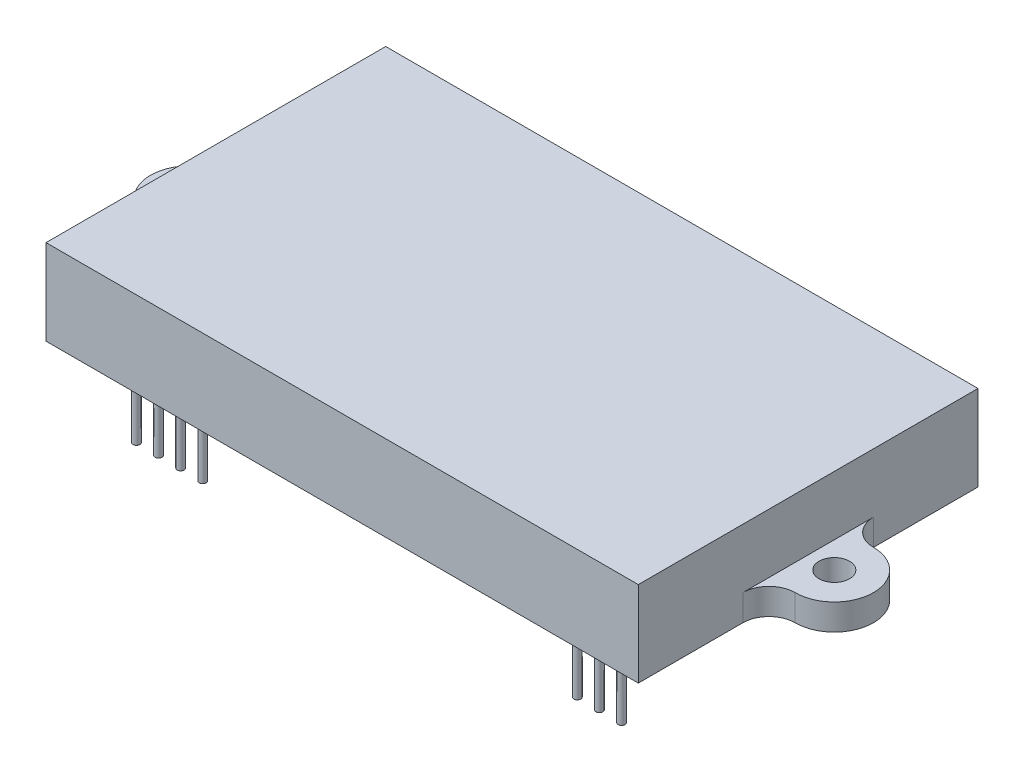
ISO-10303-21;
HEADER;
FILE_DESCRIPTION(('STEP AP214'),'2;1');
FILE_NAME('part.step','',(''),(''),'','','');
FILE_SCHEMA(('AUTOMOTIVE_DESIGN { 1 0 10303 214 1 1 1 1 }'));
ENDSEC;
DATA;
#1=APPLICATION_CONTEXT('core data for automotive mechanical design processes');
#2=APPLICATION_PROTOCOL_DEFINITION('international standard','automotive_design',2000,#1);
#3=PRODUCT_CONTEXT('',#1,'mechanical');
#4=PRODUCT('Part','Part','',(#3));
#5=PRODUCT_RELATED_PRODUCT_CATEGORY('part','',(#4));
#6=PRODUCT_DEFINITION_FORMATION('','',#4);
#7=PRODUCT_DEFINITION_CONTEXT('part definition',#1,'design');
#8=PRODUCT_DEFINITION('design','',#6,#7);
#9=PRODUCT_DEFINITION_SHAPE('','',#8);
#10=(LENGTH_UNIT() NAMED_UNIT(*) SI_UNIT(.MILLI.,.METRE.));
#11=(NAMED_UNIT(*) PLANE_ANGLE_UNIT() SI_UNIT($,.RADIAN.));
#12=(NAMED_UNIT(*) SI_UNIT($,.STERADIAN.) SOLID_ANGLE_UNIT());
#13=UNCERTAINTY_MEASURE_WITH_UNIT(LENGTH_MEASURE(1.E-05),#10,'distance_accuracy_value','');
#14=(GEOMETRIC_REPRESENTATION_CONTEXT(3) GLOBAL_UNCERTAINTY_ASSIGNED_CONTEXT((#13)) GLOBAL_UNIT_ASSIGNED_CONTEXT((#10,
#11,#12)) REPRESENTATION_CONTEXT('',''));
#15=CARTESIAN_POINT('',(0.,0.,0.));
#16=DIRECTION('',(0.,0.,1.));
#17=DIRECTION('',(1.,0.,0.));
#18=AXIS2_PLACEMENT_3D('',#15,#16,#17);
#19=CARTESIAN_POINT('',(0.,9.8,0.));
#20=DIRECTION('',(-1.,0.,0.));
#21=DIRECTION('',(0.,0.,1.));
#22=AXIS2_PLACEMENT_3D('',#19,#20,#21);
#23=PLANE('',#22);
#24=DIRECTION('',(0.,-1.,0.));
#25=VECTOR('',#24,1.);
#26=CARTESIAN_POINT('',(0.,3.,-27.));
#27=LINE('',#26,#25);
#28=CARTESIAN_POINT('',(0.,3.,-27.));
#29=VERTEX_POINT('',#28);
#30=CARTESIAN_POINT('',(0.,0.,-27.));
#31=VERTEX_POINT('',#30);
#32=EDGE_CURVE('E195',#29,#31,#27,.T.);
#33=ORIENTED_EDGE('',*,*,#32,.F.);
#34=DIRECTION('',(0.,0.,-1.));
#35=VECTOR('',#34,1.);
#36=CARTESIAN_POINT('',(0.,3.,-27.));
#37=LINE('',#36,#35);
#38=CARTESIAN_POINT('',(0.,3.,-12.));
#39=VERTEX_POINT('',#38);
#40=EDGE_CURVE('E192',#39,#29,#37,.T.);
#41=ORIENTED_EDGE('',*,*,#40,.F.);
#42=DIRECTION('',(0.,-1.,0.));
#43=VECTOR('',#42,1.);
#44=CARTESIAN_POINT('',(0.,3.,-12.));
#45=LINE('',#44,#43);
#46=CARTESIAN_POINT('',(0.,0.,-12.));
#47=VERTEX_POINT('',#46);
#48=EDGE_CURVE('E207',#39,#47,#45,.T.);
#49=ORIENTED_EDGE('',*,*,#48,.T.);
#50=DIRECTION('',(0.,0.,-1.));
#51=VECTOR('',#50,1.);
#52=CARTESIAN_POINT('',(0.,0.,0.));
#53=LINE('',#52,#51);
#54=CARTESIAN_POINT('',(0.,0.,0.));
#55=VERTEX_POINT('',#54);
#56=EDGE_CURVE('E236',#55,#47,#53,.T.);
#57=ORIENTED_EDGE('',*,*,#56,.F.);
#58=DIRECTION('',(0.,-1.,0.));
#59=VECTOR('',#58,1.);
#60=CARTESIAN_POINT('',(0.,9.8,0.));
#61=LINE('',#60,#59);
#62=CARTESIAN_POINT('',(0.,9.8,0.));
#63=VERTEX_POINT('',#62);
#64=EDGE_CURVE('E250',#63,#55,#61,.T.);
#65=ORIENTED_EDGE('',*,*,#64,.F.);
#66=DIRECTION('',(0.,0.,-1.));
#67=VECTOR('',#66,1.);
#68=CARTESIAN_POINT('',(0.,9.8,0.));
#69=LINE('',#68,#67);
#70=CARTESIAN_POINT('',(0.,9.8,-39.));
#71=VERTEX_POINT('',#70);
#72=EDGE_CURVE('E220',#63,#71,#69,.T.);
#73=ORIENTED_EDGE('',*,*,#72,.T.);
#74=DIRECTION('',(0.,-1.,0.));
#75=VECTOR('',#74,1.);
#76=CARTESIAN_POINT('',(0.,9.8,-39.));
#77=LINE('',#76,#75);
#78=CARTESIAN_POINT('',(0.,0.,-39.));
#79=VERTEX_POINT('',#78);
#80=EDGE_CURVE('E235',#71,#79,#77,.T.);
#81=ORIENTED_EDGE('',*,*,#80,.T.);
#82=EDGE_CURVE('E219',#31,#79,#53,.T.);
#83=ORIENTED_EDGE('',*,*,#82,.F.);
#84=EDGE_LOOP('',(#33,#41,#49,#57,#65,#73,#81,#83));
#85=FACE_BOUND('',#84,.T.);
#86=ADVANCED_FACE('F38',(#85),#23,.T.);
#87=CARTESIAN_POINT('',(0.,9.8,0.));
#88=DIRECTION('',(0.,0.,-1.));
#89=DIRECTION('',(-1.,0.,0.));
#90=AXIS2_PLACEMENT_3D('',#87,#88,#89);
#91=PLANE('',#90);
#92=DIRECTION('',(1.,0.,0.));
#93=VECTOR('',#92,1.);
#94=CARTESIAN_POINT('',(0.,0.,0.));
#95=LINE('',#94,#93);
#96=CARTESIAN_POINT('',(68.,0.,0.));
#97=VERTEX_POINT('',#96);
#98=EDGE_CURVE('E225',#55,#97,#95,.T.);
#99=ORIENTED_EDGE('',*,*,#98,.T.);
#100=DIRECTION('',(0.,-1.,0.));
#101=VECTOR('',#100,1.);
#102=CARTESIAN_POINT('',(68.,9.8,0.));
#103=LINE('',#102,#101);
#104=CARTESIAN_POINT('',(68.,9.8,0.));
#105=VERTEX_POINT('',#104);
#106=EDGE_CURVE('E254',#105,#97,#103,.T.);
#107=ORIENTED_EDGE('',*,*,#106,.F.);
#108=DIRECTION('',(1.,0.,0.));
#109=VECTOR('',#108,1.);
#110=CARTESIAN_POINT('',(0.,9.8,0.));
#111=LINE('',#110,#109);
#112=EDGE_CURVE('E232',#63,#105,#111,.T.);
#113=ORIENTED_EDGE('',*,*,#112,.F.);
#114=ORIENTED_EDGE('',*,*,#64,.T.);
#115=EDGE_LOOP('',(#99,#107,#113,#114));
#116=FACE_BOUND('',#115,.T.);
#117=ADVANCED_FACE('F355',(#116),#91,.F.);
#118=CARTESIAN_POINT('',(68.,9.8,0.));
#119=DIRECTION('',(-1.,0.,0.));
#120=DIRECTION('',(0.,0.,1.));
#121=AXIS2_PLACEMENT_3D('',#118,#119,#120);
#122=PLANE('',#121);
#123=DIRECTION('',(0.,0.,1.));
#124=VECTOR('',#123,1.);
#125=CARTESIAN_POINT('',(68.,3.,-12.));
#126=LINE('',#125,#124);
#127=CARTESIAN_POINT('',(68.,3.,-27.));
#128=VERTEX_POINT('',#127);
#129=CARTESIAN_POINT('',(68.,3.,-12.));
#130=VERTEX_POINT('',#129);
#131=EDGE_CURVE('E54',#128,#130,#126,.T.);
#132=ORIENTED_EDGE('',*,*,#131,.F.);
#133=DIRECTION('',(0.,-1.,0.));
#134=VECTOR('',#133,1.);
#135=CARTESIAN_POINT('',(68.,3.,-27.));
#136=LINE('',#135,#134);
#137=CARTESIAN_POINT('',(68.,0.,-27.));
#138=VERTEX_POINT('',#137);
#139=EDGE_CURVE('E170',#128,#138,#136,.T.);
#140=ORIENTED_EDGE('',*,*,#139,.T.);
#141=DIRECTION('',(0.,0.,-1.));
#142=VECTOR('',#141,1.);
#143=CARTESIAN_POINT('',(68.,0.,0.));
#144=LINE('',#143,#142);
#145=CARTESIAN_POINT('',(68.,0.,-39.));
#146=VERTEX_POINT('',#145);
#147=EDGE_CURVE('E244',#138,#146,#144,.T.);
#148=ORIENTED_EDGE('',*,*,#147,.T.);
#149=DIRECTION('',(0.,-1.,0.));
#150=VECTOR('',#149,1.);
#151=CARTESIAN_POINT('',(68.,9.8,-39.));
#152=LINE('',#151,#150);
#153=CARTESIAN_POINT('',(68.,9.8,-39.));
#154=VERTEX_POINT('',#153);
#155=EDGE_CURVE('E258',#154,#146,#152,.T.);
#156=ORIENTED_EDGE('',*,*,#155,.F.);
#157=DIRECTION('',(0.,0.,-1.));
#158=VECTOR('',#157,1.);
#159=CARTESIAN_POINT('',(68.,9.8,0.));
#160=LINE('',#159,#158);
#161=EDGE_CURVE('E229',#105,#154,#160,.T.);
#162=ORIENTED_EDGE('',*,*,#161,.F.);
#163=ORIENTED_EDGE('',*,*,#106,.T.);
#164=CARTESIAN_POINT('',(68.,0.,-12.));
#165=VERTEX_POINT('',#164);
#166=EDGE_CURVE('E245',#97,#165,#144,.T.);
#167=ORIENTED_EDGE('',*,*,#166,.T.);
#168=DIRECTION('',(0.,-1.,0.));
#169=VECTOR('',#168,1.);
#170=CARTESIAN_POINT('',(68.,3.,-12.));
#171=LINE('',#170,#169);
#172=EDGE_CURVE('E59',#130,#165,#171,.T.);
#173=ORIENTED_EDGE('',*,*,#172,.F.);
#174=EDGE_LOOP('',(#132,#140,#148,#156,#162,#163,#167,#173));
#175=FACE_BOUND('',#174,.T.);
#176=ADVANCED_FACE('F361',(#175),#122,.F.);
#177=CARTESIAN_POINT('',(0.,9.8,-39.));
#178=DIRECTION('',(0.,0.,-1.));
#179=DIRECTION('',(-1.,0.,0.));
#180=AXIS2_PLACEMENT_3D('',#177,#178,#179);
#181=PLANE('',#180);
#182=DIRECTION('',(1.,0.,0.));
#183=VECTOR('',#182,1.);
#184=CARTESIAN_POINT('',(0.,0.,-39.));
#185=LINE('',#184,#183);
#186=EDGE_CURVE('E240',#79,#146,#185,.T.);
#187=ORIENTED_EDGE('',*,*,#186,.F.);
#188=ORIENTED_EDGE('',*,*,#80,.F.);
#189=DIRECTION('',(1.,0.,0.));
#190=VECTOR('',#189,1.);
#191=CARTESIAN_POINT('',(0.,9.8,-39.));
#192=LINE('',#191,#190);
#193=EDGE_CURVE('E224',#71,#154,#192,.T.);
#194=ORIENTED_EDGE('',*,*,#193,.T.);
#195=ORIENTED_EDGE('',*,*,#155,.T.);
#196=EDGE_LOOP('',(#187,#188,#194,#195));
#197=FACE_BOUND('',#196,.T.);
#198=ADVANCED_FACE('F367',(#197),#181,.T.);
#199=CARTESIAN_POINT('',(0.,9.8,0.));
#200=DIRECTION('',(0.,-1.,0.));
#201=DIRECTION('',(0.,0.,-1.));
#202=AXIS2_PLACEMENT_3D('',#199,#200,#201);
#203=PLANE('',#202);
#204=ORIENTED_EDGE('',*,*,#72,.F.);
#205=ORIENTED_EDGE('',*,*,#112,.T.);
#206=ORIENTED_EDGE('',*,*,#161,.T.);
#207=ORIENTED_EDGE('',*,*,#193,.F.);
#208=EDGE_LOOP('',(#204,#205,#206,#207));
#209=FACE_BOUND('',#208,.T.);
#210=ADVANCED_FACE('F406',(#209),#203,.F.);
#211=CARTESIAN_POINT('',(0.,0.,0.));
#212=DIRECTION('',(0.,-1.,0.));
#213=DIRECTION('',(0.,0.,-1.));
#214=AXIS2_PLACEMENT_3D('',#211,#212,#213);
#215=PLANE('',#214);
#216=CARTESIAN_POINT('',(62.08,0.,-4.));
#217=DIRECTION('',(0.,-1.,0.));
#218=DIRECTION('',(0.,0.,-1.));
#219=AXIS2_PLACEMENT_3D('',#216,#217,#218);
#220=CIRCLE('',#219,0.399999999999998);
#221=CARTESIAN_POINT('',(62.08,0.,-4.4));
#222=VERTEX_POINT('',#221);
#223=EDGE_CURVE('E288',#222,#222,#220,.T.);
#224=ORIENTED_EDGE('',*,*,#223,.F.);
#225=EDGE_LOOP('',(#224));
#226=FACE_BOUND('',#225,.T.);
#227=CARTESIAN_POINT('',(59.54,0.,-4.));
#228=DIRECTION('',(0.,-1.,0.));
#229=DIRECTION('',(0.,0.,-1.));
#230=AXIS2_PLACEMENT_3D('',#227,#228,#229);
#231=CIRCLE('',#230,0.399999999999998);
#232=CARTESIAN_POINT('',(59.54,0.,-4.4));
#233=VERTEX_POINT('',#232);
#234=EDGE_CURVE('E284',#233,#233,#231,.T.);
#235=ORIENTED_EDGE('',*,*,#234,.F.);
#236=EDGE_LOOP('',(#235));
#237=FACE_BOUND('',#236,.T.);
#238=CARTESIAN_POINT('',(6.38,0.,-3.99999999999995));
#239=DIRECTION('',(0.,-1.,0.));
#240=DIRECTION('',(0.,0.,-1.));
#241=AXIS2_PLACEMENT_3D('',#238,#239,#240);
#242=CIRCLE('',#241,0.4);
#243=CARTESIAN_POINT('',(6.38,0.,-4.39999999999995));
#244=VERTEX_POINT('',#243);
#245=EDGE_CURVE('E280',#244,#244,#242,.T.);
#246=ORIENTED_EDGE('',*,*,#245,.F.);
#247=EDGE_LOOP('',(#246));
#248=FACE_BOUND('',#247,.T.);
#249=CARTESIAN_POINT('',(8.92,0.,-3.99999999999997));
#250=DIRECTION('',(0.,-1.,0.));
#251=DIRECTION('',(0.,0.,-1.));
#252=AXIS2_PLACEMENT_3D('',#249,#250,#251);
#253=CIRCLE('',#252,0.399999999999998);
#254=CARTESIAN_POINT('',(8.92,0.,-4.39999999999996));
#255=VERTEX_POINT('',#254);
#256=EDGE_CURVE('E276',#255,#255,#253,.T.);
#257=ORIENTED_EDGE('',*,*,#256,.F.);
#258=EDGE_LOOP('',(#257));
#259=FACE_BOUND('',#258,.T.);
#260=CARTESIAN_POINT('',(11.46,0.,-3.99999999999998));
#261=DIRECTION('',(0.,-1.,0.));
#262=DIRECTION('',(0.,0.,-1.));
#263=AXIS2_PLACEMENT_3D('',#260,#261,#262);
#264=CIRCLE('',#263,0.4);
#265=CARTESIAN_POINT('',(11.46,0.,-4.39999999999998));
#266=VERTEX_POINT('',#265);
#267=EDGE_CURVE('E272',#266,#266,#264,.T.);
#268=ORIENTED_EDGE('',*,*,#267,.F.);
#269=EDGE_LOOP('',(#268));
#270=FACE_BOUND('',#269,.T.);
#271=CARTESIAN_POINT('',(57.,0.,-4.));
#272=DIRECTION('',(0.,-1.,0.));
#273=DIRECTION('',(0.,0.,-1.));
#274=AXIS2_PLACEMENT_3D('',#271,#272,#273);
#275=CIRCLE('',#274,0.399999999999998);
#276=CARTESIAN_POINT('',(57.,0.,-4.4));
#277=VERTEX_POINT('',#276);
#278=EDGE_CURVE('E268',#277,#277,#275,.T.);
#279=ORIENTED_EDGE('',*,*,#278,.F.);
#280=EDGE_LOOP('',(#279));
#281=FACE_BOUND('',#280,.T.);
#282=CARTESIAN_POINT('',(14.,0.,-4.));
#283=DIRECTION('',(0.,-1.,0.));
#284=DIRECTION('',(0.,0.,-1.));
#285=AXIS2_PLACEMENT_3D('',#282,#283,#284);
#286=CIRCLE('',#285,0.4);
#287=CARTESIAN_POINT('',(14.,0.,-4.4));
#288=VERTEX_POINT('',#287);
#289=EDGE_CURVE('E253',#288,#288,#286,.T.);
#290=ORIENTED_EDGE('',*,*,#289,.F.);
#291=EDGE_LOOP('',(#290));
#292=FACE_BOUND('',#291,.T.);
#293=ORIENTED_EDGE('',*,*,#56,.T.);
#294=CARTESIAN_POINT('',(-3.,0.,-12.));
#295=DIRECTION('',(0.,-1.,0.));
#296=DIRECTION('',(0.,0.,-1.));
#297=AXIS2_PLACEMENT_3D('',#294,#295,#296);
#298=CIRCLE('',#297,3.);
#299=CARTESIAN_POINT('',(-3.,0.,-15.));
#300=VERTEX_POINT('',#299);
#301=EDGE_CURVE('E187',#300,#47,#298,.T.);
#302=ORIENTED_EDGE('',*,*,#301,.F.);
#303=CARTESIAN_POINT('',(-3.,0.,-19.5));
#304=DIRECTION('',(0.,1.,0.));
#305=DIRECTION('',(0.,0.,1.));
#306=AXIS2_PLACEMENT_3D('',#303,#304,#305);
#307=CIRCLE('',#306,4.5);
#308=CARTESIAN_POINT('',(-3.,0.,-24.));
#309=VERTEX_POINT('',#308);
#310=EDGE_CURVE('E199',#309,#300,#307,.T.);
#311=ORIENTED_EDGE('',*,*,#310,.F.);
#312=CARTESIAN_POINT('',(-3.,0.,-27.));
#313=DIRECTION('',(0.,-1.,0.));
#314=DIRECTION('',(0.,0.,1.));
#315=AXIS2_PLACEMENT_3D('',#312,#313,#314);
#316=CIRCLE('',#315,3.);
#317=EDGE_CURVE('E178',#31,#309,#316,.T.);
#318=ORIENTED_EDGE('',*,*,#317,.F.);
#319=ORIENTED_EDGE('',*,*,#82,.T.);
#320=ORIENTED_EDGE('',*,*,#186,.T.);
#321=ORIENTED_EDGE('',*,*,#147,.F.);
#322=CARTESIAN_POINT('',(71.,0.,-27.));
#323=DIRECTION('',(0.,-1.,0.));
#324=DIRECTION('',(0.,0.,-1.));
#325=AXIS2_PLACEMENT_3D('',#322,#323,#324);
#326=CIRCLE('',#325,3.);
#327=CARTESIAN_POINT('',(71.,0.,-24.));
#328=VERTEX_POINT('',#327);
#329=EDGE_CURVE('E157',#328,#138,#326,.T.);
#330=ORIENTED_EDGE('',*,*,#329,.F.);
#331=CARTESIAN_POINT('',(71.,0.,-19.5));
#332=DIRECTION('',(0.,1.,0.));
#333=DIRECTION('',(0.,0.,-1.));
#334=AXIS2_PLACEMENT_3D('',#331,#332,#333);
#335=CIRCLE('',#334,4.5);
#336=CARTESIAN_POINT('',(71.,0.,-15.));
#337=VERTEX_POINT('',#336);
#338=EDGE_CURVE('E164',#337,#328,#335,.T.);
#339=ORIENTED_EDGE('',*,*,#338,.F.);
#340=CARTESIAN_POINT('',(71.,0.,-12.));
#341=DIRECTION('',(0.,-1.,0.));
#342=DIRECTION('',(0.,0.,1.));
#343=AXIS2_PLACEMENT_3D('',#340,#341,#342);
#344=CIRCLE('',#343,3.);
#345=EDGE_CURVE('E140',#165,#337,#344,.T.);
#346=ORIENTED_EDGE('',*,*,#345,.F.);
#347=ORIENTED_EDGE('',*,*,#166,.F.);
#348=ORIENTED_EDGE('',*,*,#98,.F.);
#349=EDGE_LOOP('',(#293,#302,#311,#318,#319,#320,#321,#330,#339,#346,#347,#348));
#350=FACE_BOUND('',#349,.T.);
#351=CARTESIAN_POINT('',(-3.,0.,-19.5));
#352=DIRECTION('',(0.,1.,0.));
#353=DIRECTION('',(0.,0.,1.));
#354=AXIS2_PLACEMENT_3D('',#351,#352,#353);
#355=CIRCLE('',#354,1.75);
#356=CARTESIAN_POINT('',(-3.,0.,-17.75));
#357=VERTEX_POINT('',#356);
#358=EDGE_CURVE('E173',#357,#357,#355,.T.);
#359=ORIENTED_EDGE('',*,*,#358,.T.);
#360=EDGE_LOOP('',(#359));
#361=FACE_BOUND('',#360,.T.);
#362=CARTESIAN_POINT('',(71.,0.,-19.5));
#363=DIRECTION('',(0.,1.,0.));
#364=DIRECTION('',(0.,0.,1.));
#365=AXIS2_PLACEMENT_3D('',#362,#363,#364);
#366=CIRCLE('',#365,1.75);
#367=CARTESIAN_POINT('',(71.,0.,-17.75));
#368=VERTEX_POINT('',#367);
#369=EDGE_CURVE('E423',#368,#368,#366,.T.);
#370=ORIENTED_EDGE('',*,*,#369,.T.);
#371=EDGE_LOOP('',(#370));
#372=FACE_BOUND('',#371,.T.);
#373=ADVANCED_FACE('F402',(#226,#237,#248,#259,#270,#281,#292,#350,#361,#372),#215,.T.);
#374=CARTESIAN_POINT('',(-3.,3.,-27.));
#375=DIRECTION('',(0.,1.,0.));
#376=DIRECTION('',(0.,0.,1.));
#377=AXIS2_PLACEMENT_3D('',#374,#375,#376);
#378=PLANE('',#377);
#379=CARTESIAN_POINT('',(-3.,3.,-27.));
#380=DIRECTION('',(0.,-1.,0.));
#381=DIRECTION('',(0.,0.,1.));
#382=AXIS2_PLACEMENT_3D('',#379,#380,#381);
#383=CIRCLE('',#382,3.);
#384=CARTESIAN_POINT('',(-3.,3.,-24.));
#385=VERTEX_POINT('',#384);
#386=EDGE_CURVE('E182',#29,#385,#383,.T.);
#387=ORIENTED_EDGE('',*,*,#386,.T.);
#388=CARTESIAN_POINT('',(-3.,3.,-19.5));
#389=DIRECTION('',(0.,1.,0.));
#390=DIRECTION('',(0.,0.,1.));
#391=AXIS2_PLACEMENT_3D('',#388,#389,#390);
#392=CIRCLE('',#391,4.5);
#393=CARTESIAN_POINT('',(-3.,3.,-15.));
#394=VERTEX_POINT('',#393);
#395=EDGE_CURVE('E186',#385,#394,#392,.T.);
#396=ORIENTED_EDGE('',*,*,#395,.T.);
#397=CARTESIAN_POINT('',(-3.,3.,-12.));
#398=DIRECTION('',(0.,-1.,0.));
#399=DIRECTION('',(0.,0.,-1.));
#400=AXIS2_PLACEMENT_3D('',#397,#398,#399);
#401=CIRCLE('',#400,3.);
#402=EDGE_CURVE('E190',#394,#39,#401,.T.);
#403=ORIENTED_EDGE('',*,*,#402,.T.);
#404=ORIENTED_EDGE('',*,*,#40,.T.);
#405=EDGE_LOOP('',(#387,#396,#403,#404));
#406=FACE_BOUND('',#405,.T.);
#407=CARTESIAN_POINT('',(-3.,3.,-19.5));
#408=DIRECTION('',(0.,1.,0.));
#409=DIRECTION('',(0.,0.,1.));
#410=AXIS2_PLACEMENT_3D('',#407,#408,#409);
#411=CIRCLE('',#410,1.75);
#412=CARTESIAN_POINT('',(-3.,3.,-17.75));
#413=VERTEX_POINT('',#412);
#414=EDGE_CURVE('E174',#413,#413,#411,.T.);
#415=ORIENTED_EDGE('',*,*,#414,.F.);
#416=EDGE_LOOP('',(#415));
#417=FACE_BOUND('',#416,.T.);
#418=ADVANCED_FACE('F405',(#406,#417),#378,.T.);
#419=CARTESIAN_POINT('',(-3.,3.,-27.));
#420=DIRECTION('',(0.,-1.,0.));
#421=DIRECTION('',(0.,0.,-1.));
#422=AXIS2_PLACEMENT_3D('',#419,#420,#421);
#423=CYLINDRICAL_SURFACE('',#422,3.);
#424=ORIENTED_EDGE('',*,*,#317,.T.);
#425=DIRECTION('',(0.,-1.,0.));
#426=VECTOR('',#425,1.);
#427=CARTESIAN_POINT('',(-3.,3.,-24.));
#428=LINE('',#427,#426);
#429=EDGE_CURVE('E215',#385,#309,#428,.T.);
#430=ORIENTED_EDGE('',*,*,#429,.F.);
#431=ORIENTED_EDGE('',*,*,#386,.F.);
#432=ORIENTED_EDGE('',*,*,#32,.T.);
#433=EDGE_LOOP('',(#424,#430,#431,#432));
#434=FACE_BOUND('',#433,.T.);
#435=ADVANCED_FACE('F467',(#434),#423,.F.);
#436=CARTESIAN_POINT('',(-3.,3.,-19.5));
#437=DIRECTION('',(0.,-1.,0.));
#438=DIRECTION('',(0.,0.,-1.));
#439=AXIS2_PLACEMENT_3D('',#436,#437,#438);
#440=CYLINDRICAL_SURFACE('',#439,4.5);
#441=ORIENTED_EDGE('',*,*,#310,.T.);
#442=DIRECTION('',(0.,-1.,0.));
#443=VECTOR('',#442,1.);
#444=CARTESIAN_POINT('',(-3.,3.,-15.));
#445=LINE('',#444,#443);
#446=EDGE_CURVE('E211',#394,#300,#445,.T.);
#447=ORIENTED_EDGE('',*,*,#446,.F.);
#448=ORIENTED_EDGE('',*,*,#395,.F.);
#449=ORIENTED_EDGE('',*,*,#429,.T.);
#450=EDGE_LOOP('',(#441,#447,#448,#449));
#451=FACE_BOUND('',#450,.T.);
#452=ADVANCED_FACE('F471',(#451),#440,.T.);
#453=CARTESIAN_POINT('',(-3.,3.,-12.));
#454=DIRECTION('',(0.,-1.,0.));
#455=DIRECTION('',(0.,0.,-1.));
#456=AXIS2_PLACEMENT_3D('',#453,#454,#455);
#457=CYLINDRICAL_SURFACE('',#456,3.);
#458=ORIENTED_EDGE('',*,*,#301,.T.);
#459=ORIENTED_EDGE('',*,*,#48,.F.);
#460=ORIENTED_EDGE('',*,*,#402,.F.);
#461=ORIENTED_EDGE('',*,*,#446,.T.);
#462=EDGE_LOOP('',(#458,#459,#460,#461));
#463=FACE_BOUND('',#462,.T.);
#464=ADVANCED_FACE('F463',(#463),#457,.F.);
#465=CARTESIAN_POINT('',(-3.,3.,-19.5));
#466=DIRECTION('',(0.,-1.,0.));
#467=DIRECTION('',(0.,0.,-1.));
#468=AXIS2_PLACEMENT_3D('',#465,#466,#467);
#469=CYLINDRICAL_SURFACE('',#468,1.75);
#470=ORIENTED_EDGE('',*,*,#414,.T.);
#471=EDGE_LOOP('',(#470));
#472=FACE_BOUND('',#471,.T.);
#473=ORIENTED_EDGE('',*,*,#358,.F.);
#474=EDGE_LOOP('',(#473));
#475=FACE_BOUND('',#474,.T.);
#476=ADVANCED_FACE('F457',(#472,#475),#469,.F.);
#477=CARTESIAN_POINT('',(71.,3.,-27.));
#478=DIRECTION('',(0.,-1.,0.));
#479=DIRECTION('',(0.,0.,-1.));
#480=AXIS2_PLACEMENT_3D('',#477,#478,#479);
#481=PLANE('',#480);
#482=CARTESIAN_POINT('',(71.,3.,-27.));
#483=DIRECTION('',(0.,-1.,0.));
#484=DIRECTION('',(0.,0.,-1.));
#485=AXIS2_PLACEMENT_3D('',#482,#483,#484);
#486=CIRCLE('',#485,3.);
#487=CARTESIAN_POINT('',(71.,3.,-24.));
#488=VERTEX_POINT('',#487);
#489=EDGE_CURVE('E166',#488,#128,#486,.T.);
#490=ORIENTED_EDGE('',*,*,#489,.T.);
#491=ORIENTED_EDGE('',*,*,#131,.T.);
#492=CARTESIAN_POINT('',(71.,3.,-12.));
#493=DIRECTION('',(0.,-1.,0.));
#494=DIRECTION('',(0.,0.,1.));
#495=AXIS2_PLACEMENT_3D('',#492,#493,#494);
#496=CIRCLE('',#495,3.);
#497=CARTESIAN_POINT('',(71.,3.,-15.));
#498=VERTEX_POINT('',#497);
#499=EDGE_CURVE('E126',#130,#498,#496,.T.);
#500=ORIENTED_EDGE('',*,*,#499,.T.);
#501=CARTESIAN_POINT('',(71.,3.,-19.5));
#502=DIRECTION('',(0.,1.,0.));
#503=DIRECTION('',(0.,0.,-1.));
#504=AXIS2_PLACEMENT_3D('',#501,#502,#503);
#505=CIRCLE('',#504,4.5);
#506=EDGE_CURVE('E131',#498,#488,#505,.T.);
#507=ORIENTED_EDGE('',*,*,#506,.T.);
#508=EDGE_LOOP('',(#490,#491,#500,#507));
#509=FACE_BOUND('',#508,.T.);
#510=CARTESIAN_POINT('',(71.,3.,-19.5));
#511=DIRECTION('',(0.,1.,0.));
#512=DIRECTION('',(0.,0.,1.));
#513=AXIS2_PLACEMENT_3D('',#510,#511,#512);
#514=CIRCLE('',#513,1.75);
#515=CARTESIAN_POINT('',(71.,3.,-17.75));
#516=VERTEX_POINT('',#515);
#517=EDGE_CURVE('E161',#516,#516,#514,.T.);
#518=ORIENTED_EDGE('',*,*,#517,.F.);
#519=EDGE_LOOP('',(#518));
#520=FACE_BOUND('',#519,.T.);
#521=ADVANCED_FACE('F128',(#509,#520),#481,.F.);
#522=CARTESIAN_POINT('',(71.,3.,-27.));
#523=DIRECTION('',(0.,-1.,0.));
#524=DIRECTION('',(0.,0.,-1.));
#525=AXIS2_PLACEMENT_3D('',#522,#523,#524);
#526=CYLINDRICAL_SURFACE('',#525,3.);
#527=ORIENTED_EDGE('',*,*,#329,.T.);
#528=ORIENTED_EDGE('',*,*,#139,.F.);
#529=ORIENTED_EDGE('',*,*,#489,.F.);
#530=DIRECTION('',(0.,-1.,0.));
#531=VECTOR('',#530,1.);
#532=CARTESIAN_POINT('',(71.,3.,-24.));
#533=LINE('',#532,#531);
#534=EDGE_CURVE('E144',#488,#328,#533,.T.);
#535=ORIENTED_EDGE('',*,*,#534,.T.);
#536=EDGE_LOOP('',(#527,#528,#529,#535));
#537=FACE_BOUND('',#536,.T.);
#538=ADVANCED_FACE('F449',(#537),#526,.F.);
#539=CARTESIAN_POINT('',(71.,3.,-12.));
#540=DIRECTION('',(0.,-1.,0.));
#541=DIRECTION('',(0.,0.,-1.));
#542=AXIS2_PLACEMENT_3D('',#539,#540,#541);
#543=CYLINDRICAL_SURFACE('',#542,3.);
#544=ORIENTED_EDGE('',*,*,#345,.T.);
#545=DIRECTION('',(0.,-1.,0.));
#546=VECTOR('',#545,1.);
#547=CARTESIAN_POINT('',(71.,3.,-15.));
#548=LINE('',#547,#546);
#549=EDGE_CURVE('E137',#498,#337,#548,.T.);
#550=ORIENTED_EDGE('',*,*,#549,.F.);
#551=ORIENTED_EDGE('',*,*,#499,.F.);
#552=ORIENTED_EDGE('',*,*,#172,.T.);
#553=EDGE_LOOP('',(#544,#550,#551,#552));
#554=FACE_BOUND('',#553,.T.);
#555=ADVANCED_FACE('F138',(#554),#543,.F.);
#556=CARTESIAN_POINT('',(71.,3.,-19.5));
#557=DIRECTION('',(0.,-1.,0.));
#558=DIRECTION('',(0.,0.,-1.));
#559=AXIS2_PLACEMENT_3D('',#556,#557,#558);
#560=CYLINDRICAL_SURFACE('',#559,4.5);
#561=ORIENTED_EDGE('',*,*,#338,.T.);
#562=ORIENTED_EDGE('',*,*,#534,.F.);
#563=ORIENTED_EDGE('',*,*,#506,.F.);
#564=ORIENTED_EDGE('',*,*,#549,.T.);
#565=EDGE_LOOP('',(#561,#562,#563,#564));
#566=FACE_BOUND('',#565,.T.);
#567=ADVANCED_FACE('F146',(#566),#560,.T.);
#568=CARTESIAN_POINT('',(71.,3.,-19.5));
#569=DIRECTION('',(0.,-1.,0.));
#570=DIRECTION('',(0.,0.,-1.));
#571=AXIS2_PLACEMENT_3D('',#568,#569,#570);
#572=CYLINDRICAL_SURFACE('',#571,1.75);
#573=ORIENTED_EDGE('',*,*,#517,.T.);
#574=EDGE_LOOP('',(#573));
#575=FACE_BOUND('',#574,.T.);
#576=ORIENTED_EDGE('',*,*,#369,.F.);
#577=EDGE_LOOP('',(#576));
#578=FACE_BOUND('',#577,.T.);
#579=ADVANCED_FACE('F526',(#575,#578),#572,.F.);
#580=CARTESIAN_POINT('',(14.,-8.9,-4.));
#581=DIRECTION('',(0.,1.,0.));
#582=DIRECTION('',(0.,0.,1.));
#583=AXIS2_PLACEMENT_3D('',#580,#581,#582);
#584=CYLINDRICAL_SURFACE('',#583,0.4);
#585=CARTESIAN_POINT('',(14.,-8.88,-4.));
#586=DIRECTION('',(0.,1.,0.));
#587=DIRECTION('',(0.,0.,1.));
#588=AXIS2_PLACEMENT_3D('',#585,#586,#587);
#589=CIRCLE('',#588,0.4);
#590=CARTESIAN_POINT('',(14.,-8.88,-3.6));
#591=VERTEX_POINT('',#590);
#592=EDGE_CURVE('E47',#591,#591,#589,.T.);
#593=ORIENTED_EDGE('',*,*,#592,.T.);
#594=EDGE_LOOP('',(#593));
#595=FACE_BOUND('',#594,.T.);
#596=ORIENTED_EDGE('',*,*,#289,.T.);
#597=EDGE_LOOP('',(#596));
#598=FACE_BOUND('',#597,.T.);
#599=ADVANCED_FACE('F342',(#595,#598),#584,.T.);
#600=CARTESIAN_POINT('',(14.,-8.9,-4.));
#601=DIRECTION('',(0.,1.,0.));
#602=DIRECTION('',(0.,0.,1.));
#603=AXIS2_PLACEMENT_3D('',#600,#601,#602);
#604=PLANE('',#603);
#605=CARTESIAN_POINT('',(14.,-8.9,-4.));
#606=DIRECTION('',(0.,1.,0.));
#607=DIRECTION('',(0.,0.,1.));
#608=AXIS2_PLACEMENT_3D('',#605,#606,#607);
#609=CIRCLE('',#608,0.38);
#610=CARTESIAN_POINT('',(14.,-8.9,-3.62));
#611=VERTEX_POINT('',#610);
#612=EDGE_CURVE('E11',#611,#611,#609,.F.);
#613=ORIENTED_EDGE('',*,*,#612,.T.);
#614=EDGE_LOOP('',(#613));
#615=FACE_BOUND('',#614,.T.);
#616=ADVANCED_FACE('F541',(#615),#604,.F.);
#617=CARTESIAN_POINT('',(57.,-8.9,-4.));
#618=DIRECTION('',(0.,1.,0.));
#619=DIRECTION('',(0.,0.,1.));
#620=AXIS2_PLACEMENT_3D('',#617,#618,#619);
#621=CYLINDRICAL_SURFACE('',#620,0.399999999999998);
#622=CARTESIAN_POINT('',(57.,-8.88,-4.));
#623=DIRECTION('',(0.,1.,0.));
#624=DIRECTION('',(0.,0.,1.));
#625=AXIS2_PLACEMENT_3D('',#622,#623,#624);
#626=CIRCLE('',#625,0.399999999999998);
#627=CARTESIAN_POINT('',(57.,-8.88,-3.6));
#628=VERTEX_POINT('',#627);
#629=EDGE_CURVE('E308',#628,#628,#626,.T.);
#630=ORIENTED_EDGE('',*,*,#629,.T.);
#631=EDGE_LOOP('',(#630));
#632=FACE_BOUND('',#631,.T.);
#633=ORIENTED_EDGE('',*,*,#278,.T.);
#634=EDGE_LOOP('',(#633));
#635=FACE_BOUND('',#634,.T.);
#636=ADVANCED_FACE('F549',(#632,#635),#621,.T.);
#637=CARTESIAN_POINT('',(57.,-8.9,-4.));
#638=DIRECTION('',(0.,1.,0.));
#639=DIRECTION('',(0.,0.,1.));
#640=AXIS2_PLACEMENT_3D('',#637,#638,#639);
#641=PLANE('',#640);
#642=CARTESIAN_POINT('',(57.,-8.9,-4.));
#643=DIRECTION('',(0.,1.,0.));
#644=DIRECTION('',(0.,0.,1.));
#645=AXIS2_PLACEMENT_3D('',#642,#643,#644);
#646=CIRCLE('',#645,0.379999999999998);
#647=CARTESIAN_POINT('',(57.,-8.9,-3.62));
#648=VERTEX_POINT('',#647);
#649=EDGE_CURVE('E312',#648,#648,#646,.F.);
#650=ORIENTED_EDGE('',*,*,#649,.T.);
#651=EDGE_LOOP('',(#650));
#652=FACE_BOUND('',#651,.T.);
#653=ADVANCED_FACE('F558',(#652),#641,.F.);
#654=CARTESIAN_POINT('',(11.46,-8.9,-3.99999999999998));
#655=DIRECTION('',(0.,1.,0.));
#656=DIRECTION('',(0.,0.,1.));
#657=AXIS2_PLACEMENT_3D('',#654,#655,#656);
#658=CYLINDRICAL_SURFACE('',#657,0.4);
#659=CARTESIAN_POINT('',(11.46,-8.88,-3.99999999999998));
#660=DIRECTION('',(0.,1.,0.));
#661=DIRECTION('',(0.,0.,1.));
#662=AXIS2_PLACEMENT_3D('',#659,#660,#661);
#663=CIRCLE('',#662,0.4);
#664=CARTESIAN_POINT('',(11.46,-8.88,-3.59999999999998));
#665=VERTEX_POINT('',#664);
#666=EDGE_CURVE('E316',#665,#665,#663,.T.);
#667=ORIENTED_EDGE('',*,*,#666,.T.);
#668=EDGE_LOOP('',(#667));
#669=FACE_BOUND('',#668,.T.);
#670=ORIENTED_EDGE('',*,*,#267,.T.);
#671=EDGE_LOOP('',(#670));
#672=FACE_BOUND('',#671,.T.);
#673=ADVANCED_FACE('F567',(#669,#672),#658,.T.);
#674=CARTESIAN_POINT('',(11.46,-8.9,-3.99999999999998));
#675=DIRECTION('',(0.,1.,0.));
#676=DIRECTION('',(0.,0.,1.));
#677=AXIS2_PLACEMENT_3D('',#674,#675,#676);
#678=PLANE('',#677);
#679=CARTESIAN_POINT('',(11.46,-8.9,-3.99999999999998));
#680=DIRECTION('',(0.,1.,0.));
#681=DIRECTION('',(0.,0.,1.));
#682=AXIS2_PLACEMENT_3D('',#679,#680,#681);
#683=CIRCLE('',#682,0.38);
#684=CARTESIAN_POINT('',(11.46,-8.9,-3.61999999999998));
#685=VERTEX_POINT('',#684);
#686=EDGE_CURVE('E320',#685,#685,#683,.F.);
#687=ORIENTED_EDGE('',*,*,#686,.T.);
#688=EDGE_LOOP('',(#687));
#689=FACE_BOUND('',#688,.T.);
#690=ADVANCED_FACE('F398',(#689),#678,.F.);
#691=CARTESIAN_POINT('',(8.92,-8.9,-3.99999999999997));
#692=DIRECTION('',(0.,1.,0.));
#693=DIRECTION('',(0.,0.,1.));
#694=AXIS2_PLACEMENT_3D('',#691,#692,#693);
#695=CYLINDRICAL_SURFACE('',#694,0.399999999999998);
#696=CARTESIAN_POINT('',(8.92,-8.88,-3.99999999999997));
#697=DIRECTION('',(0.,1.,0.));
#698=DIRECTION('',(0.,0.,1.));
#699=AXIS2_PLACEMENT_3D('',#696,#697,#698);
#700=CIRCLE('',#699,0.399999999999998);
#701=CARTESIAN_POINT('',(8.92,-8.88,-3.59999999999997));
#702=VERTEX_POINT('',#701);
#703=EDGE_CURVE('E323',#702,#702,#700,.T.);
#704=ORIENTED_EDGE('',*,*,#703,.T.);
#705=EDGE_LOOP('',(#704));
#706=FACE_BOUND('',#705,.T.);
#707=ORIENTED_EDGE('',*,*,#256,.T.);
#708=EDGE_LOOP('',(#707));
#709=FACE_BOUND('',#708,.T.);
#710=ADVANCED_FACE('F394',(#706,#709),#695,.T.);
#711=CARTESIAN_POINT('',(8.92,-8.9,-3.99999999999997));
#712=DIRECTION('',(0.,1.,0.));
#713=DIRECTION('',(0.,0.,1.));
#714=AXIS2_PLACEMENT_3D('',#711,#712,#713);
#715=PLANE('',#714);
#716=CARTESIAN_POINT('',(8.92,-8.9,-3.99999999999997));
#717=DIRECTION('',(0.,1.,0.));
#718=DIRECTION('',(0.,0.,1.));
#719=AXIS2_PLACEMENT_3D('',#716,#717,#718);
#720=CIRCLE('',#719,0.379999999999998);
#721=CARTESIAN_POINT('',(8.92,-8.9,-3.61999999999997));
#722=VERTEX_POINT('',#721);
#723=EDGE_CURVE('E327',#722,#722,#720,.F.);
#724=ORIENTED_EDGE('',*,*,#723,.T.);
#725=EDGE_LOOP('',(#724));
#726=FACE_BOUND('',#725,.T.);
#727=ADVANCED_FACE('F397',(#726),#715,.F.);
#728=CARTESIAN_POINT('',(6.38,-8.9,-3.99999999999995));
#729=DIRECTION('',(0.,1.,0.));
#730=DIRECTION('',(0.,0.,1.));
#731=AXIS2_PLACEMENT_3D('',#728,#729,#730);
#732=CYLINDRICAL_SURFACE('',#731,0.4);
#733=CARTESIAN_POINT('',(6.38,-8.88,-3.99999999999995));
#734=DIRECTION('',(0.,1.,0.));
#735=DIRECTION('',(0.,0.,1.));
#736=AXIS2_PLACEMENT_3D('',#733,#734,#735);
#737=CIRCLE('',#736,0.4);
#738=CARTESIAN_POINT('',(6.38,-8.88,-3.59999999999995));
#739=VERTEX_POINT('',#738);
#740=EDGE_CURVE('E331',#739,#739,#737,.T.);
#741=ORIENTED_EDGE('',*,*,#740,.T.);
#742=EDGE_LOOP('',(#741));
#743=FACE_BOUND('',#742,.T.);
#744=ORIENTED_EDGE('',*,*,#245,.T.);
#745=EDGE_LOOP('',(#744));
#746=FACE_BOUND('',#745,.T.);
#747=ADVANCED_FACE('F597',(#743,#746),#732,.T.);
#748=CARTESIAN_POINT('',(6.38,-8.9,-3.99999999999995));
#749=DIRECTION('',(0.,1.,0.));
#750=DIRECTION('',(0.,0.,1.));
#751=AXIS2_PLACEMENT_3D('',#748,#749,#750);
#752=PLANE('',#751);
#753=CARTESIAN_POINT('',(6.38,-8.9,-3.99999999999995));
#754=DIRECTION('',(0.,1.,0.));
#755=DIRECTION('',(0.,0.,1.));
#756=AXIS2_PLACEMENT_3D('',#753,#754,#755);
#757=CIRCLE('',#756,0.38);
#758=CARTESIAN_POINT('',(6.38,-8.9,-3.61999999999995));
#759=VERTEX_POINT('',#758);
#760=EDGE_CURVE('E335',#759,#759,#757,.F.);
#761=ORIENTED_EDGE('',*,*,#760,.T.);
#762=EDGE_LOOP('',(#761));
#763=FACE_BOUND('',#762,.T.);
#764=ADVANCED_FACE('F606',(#763),#752,.F.);
#765=CARTESIAN_POINT('',(59.54,-8.9,-4.));
#766=DIRECTION('',(0.,1.,0.));
#767=DIRECTION('',(0.,0.,1.));
#768=AXIS2_PLACEMENT_3D('',#765,#766,#767);
#769=CYLINDRICAL_SURFACE('',#768,0.399999999999998);
#770=CARTESIAN_POINT('',(59.54,-8.88,-4.));
#771=DIRECTION('',(0.,1.,0.));
#772=DIRECTION('',(0.,0.,1.));
#773=AXIS2_PLACEMENT_3D('',#770,#771,#772);
#774=CIRCLE('',#773,0.399999999999998);
#775=CARTESIAN_POINT('',(59.54,-8.88,-3.6));
#776=VERTEX_POINT('',#775);
#777=EDGE_CURVE('E300',#776,#776,#774,.T.);
#778=ORIENTED_EDGE('',*,*,#777,.T.);
#779=EDGE_LOOP('',(#778));
#780=FACE_BOUND('',#779,.T.);
#781=ORIENTED_EDGE('',*,*,#234,.T.);
#782=EDGE_LOOP('',(#781));
#783=FACE_BOUND('',#782,.T.);
#784=ADVANCED_FACE('F615',(#780,#783),#769,.T.);
#785=CARTESIAN_POINT('',(59.54,-8.9,-4.));
#786=DIRECTION('',(0.,1.,0.));
#787=DIRECTION('',(0.,0.,1.));
#788=AXIS2_PLACEMENT_3D('',#785,#786,#787);
#789=PLANE('',#788);
#790=CARTESIAN_POINT('',(59.54,-8.9,-4.));
#791=DIRECTION('',(0.,1.,0.));
#792=DIRECTION('',(0.,0.,1.));
#793=AXIS2_PLACEMENT_3D('',#790,#791,#792);
#794=CIRCLE('',#793,0.379999999999998);
#795=CARTESIAN_POINT('',(59.54,-8.9,-3.62));
#796=VERTEX_POINT('',#795);
#797=EDGE_CURVE('E304',#796,#796,#794,.F.);
#798=ORIENTED_EDGE('',*,*,#797,.T.);
#799=EDGE_LOOP('',(#798));
#800=FACE_BOUND('',#799,.T.);
#801=ADVANCED_FACE('F624',(#800),#789,.F.);
#802=CARTESIAN_POINT('',(62.08,-8.9,-4.));
#803=DIRECTION('',(0.,1.,0.));
#804=DIRECTION('',(0.,0.,1.));
#805=AXIS2_PLACEMENT_3D('',#802,#803,#804);
#806=CYLINDRICAL_SURFACE('',#805,0.399999999999998);
#807=CARTESIAN_POINT('',(62.08,-8.88,-4.));
#808=DIRECTION('',(0.,1.,0.));
#809=DIRECTION('',(0.,0.,1.));
#810=AXIS2_PLACEMENT_3D('',#807,#808,#809);
#811=CIRCLE('',#810,0.399999999999998);
#812=CARTESIAN_POINT('',(62.08,-8.88,-3.6));
#813=VERTEX_POINT('',#812);
#814=EDGE_CURVE('E292',#813,#813,#811,.T.);
#815=ORIENTED_EDGE('',*,*,#814,.T.);
#816=EDGE_LOOP('',(#815));
#817=FACE_BOUND('',#816,.T.);
#818=ORIENTED_EDGE('',*,*,#223,.T.);
#819=EDGE_LOOP('',(#818));
#820=FACE_BOUND('',#819,.T.);
#821=ADVANCED_FACE('F633',(#817,#820),#806,.T.);
#822=CARTESIAN_POINT('',(62.08,-8.9,-4.));
#823=DIRECTION('',(0.,1.,0.));
#824=DIRECTION('',(0.,0.,1.));
#825=AXIS2_PLACEMENT_3D('',#822,#823,#824);
#826=PLANE('',#825);
#827=CARTESIAN_POINT('',(62.08,-8.9,-4.));
#828=DIRECTION('',(0.,1.,0.));
#829=DIRECTION('',(0.,0.,1.));
#830=AXIS2_PLACEMENT_3D('',#827,#828,#829);
#831=CIRCLE('',#830,0.379999999999998);
#832=CARTESIAN_POINT('',(62.08,-8.9,-3.62));
#833=VERTEX_POINT('',#832);
#834=EDGE_CURVE('E296',#833,#833,#831,.F.);
#835=ORIENTED_EDGE('',*,*,#834,.T.);
#836=EDGE_LOOP('',(#835));
#837=FACE_BOUND('',#836,.T.);
#838=ADVANCED_FACE('F373',(#837),#826,.F.);
#839=CARTESIAN_POINT('',(62.08,-8.88,-4.));
#840=DIRECTION('',(0.,1.,0.));
#841=DIRECTION('',(0.,0.,1.));
#842=AXIS2_PLACEMENT_3D('',#839,#840,#841);
#843=TOROIDAL_SURFACE('',#842,0.379999999999998,0.02);
#844=ORIENTED_EDGE('',*,*,#834,.F.);
#845=EDGE_LOOP('',(#844));
#846=FACE_BOUND('',#845,.T.);
#847=ORIENTED_EDGE('',*,*,#814,.F.);
#848=EDGE_LOOP('',(#847));
#849=FACE_BOUND('',#848,.T.);
#850=ADVANCED_FACE('F369',(#846,#849),#843,.T.);
#851=CARTESIAN_POINT('',(59.54,-8.88,-4.));
#852=DIRECTION('',(0.,1.,0.));
#853=DIRECTION('',(0.,0.,1.));
#854=AXIS2_PLACEMENT_3D('',#851,#852,#853);
#855=TOROIDAL_SURFACE('',#854,0.379999999999998,0.02);
#856=ORIENTED_EDGE('',*,*,#797,.F.);
#857=EDGE_LOOP('',(#856));
#858=FACE_BOUND('',#857,.T.);
#859=ORIENTED_EDGE('',*,*,#777,.F.);
#860=EDGE_LOOP('',(#859));
#861=FACE_BOUND('',#860,.T.);
#862=ADVANCED_FACE('F372',(#858,#861),#855,.T.);
#863=CARTESIAN_POINT('',(57.,-8.88,-4.));
#864=DIRECTION('',(0.,1.,0.));
#865=DIRECTION('',(0.,0.,1.));
#866=AXIS2_PLACEMENT_3D('',#863,#864,#865);
#867=TOROIDAL_SURFACE('',#866,0.379999999999998,0.02);
#868=ORIENTED_EDGE('',*,*,#649,.F.);
#869=EDGE_LOOP('',(#868));
#870=FACE_BOUND('',#869,.T.);
#871=ORIENTED_EDGE('',*,*,#629,.F.);
#872=EDGE_LOOP('',(#871));
#873=FACE_BOUND('',#872,.T.);
#874=ADVANCED_FACE('F377',(#870,#873),#867,.T.);
#875=CARTESIAN_POINT('',(11.46,-8.88,-3.99999999999998));
#876=DIRECTION('',(0.,1.,0.));
#877=DIRECTION('',(0.,0.,1.));
#878=AXIS2_PLACEMENT_3D('',#875,#876,#877);
#879=TOROIDAL_SURFACE('',#878,0.38,0.02);
#880=ORIENTED_EDGE('',*,*,#686,.F.);
#881=EDGE_LOOP('',(#880));
#882=FACE_BOUND('',#881,.T.);
#883=ORIENTED_EDGE('',*,*,#666,.F.);
#884=EDGE_LOOP('',(#883));
#885=FACE_BOUND('',#884,.T.);
#886=ADVANCED_FACE('F381',(#882,#885),#879,.T.);
#887=CARTESIAN_POINT('',(8.92,-8.88,-3.99999999999997));
#888=DIRECTION('',(0.,1.,0.));
#889=DIRECTION('',(0.,0.,1.));
#890=AXIS2_PLACEMENT_3D('',#887,#888,#889);
#891=TOROIDAL_SURFACE('',#890,0.379999999999998,0.02);
#892=ORIENTED_EDGE('',*,*,#723,.F.);
#893=EDGE_LOOP('',(#892));
#894=FACE_BOUND('',#893,.T.);
#895=ORIENTED_EDGE('',*,*,#703,.F.);
#896=EDGE_LOOP('',(#895));
#897=FACE_BOUND('',#896,.T.);
#898=ADVANCED_FACE('F351',(#894,#897),#891,.T.);
#899=CARTESIAN_POINT('',(6.38,-8.88,-3.99999999999995));
#900=DIRECTION('',(0.,1.,0.));
#901=DIRECTION('',(0.,0.,1.));
#902=AXIS2_PLACEMENT_3D('',#899,#900,#901);
#903=TOROIDAL_SURFACE('',#902,0.38,0.02);
#904=ORIENTED_EDGE('',*,*,#760,.F.);
#905=EDGE_LOOP('',(#904));
#906=FACE_BOUND('',#905,.T.);
#907=ORIENTED_EDGE('',*,*,#740,.F.);
#908=EDGE_LOOP('',(#907));
#909=FACE_BOUND('',#908,.T.);
#910=ADVANCED_FACE('F346',(#906,#909),#903,.T.);
#911=CARTESIAN_POINT('',(14.,-8.88,-4.));
#912=DIRECTION('',(0.,1.,0.));
#913=DIRECTION('',(0.,0.,1.));
#914=AXIS2_PLACEMENT_3D('',#911,#912,#913);
#915=TOROIDAL_SURFACE('',#914,0.38,0.02);
#916=ORIENTED_EDGE('',*,*,#612,.F.);
#917=EDGE_LOOP('',(#916));
#918=FACE_BOUND('',#917,.T.);
#919=ORIENTED_EDGE('',*,*,#592,.F.);
#920=EDGE_LOOP('',(#919));
#921=FACE_BOUND('',#920,.T.);
#922=ADVANCED_FACE('F40',(#918,#921),#915,.T.);
#923=CLOSED_SHELL('',(#86,#117,#176,#198,#210,#373,#418,#435,#452,#464,#476,#521,#538,#555,#567,
#579,#599,#616,#636,#653,#673,#690,#710,#727,#747,#764,#784,#801,#821,#838,#850,#862,#874,#886,
#898,#910,#922));
#924=MANIFOLD_SOLID_BREP('B2',#923);
#925=ADVANCED_BREP_SHAPE_REPRESENTATION('',(#18,#924),#14);
#926=SHAPE_DEFINITION_REPRESENTATION(#9,#925);
ENDSEC;
END-ISO-10303-21;
